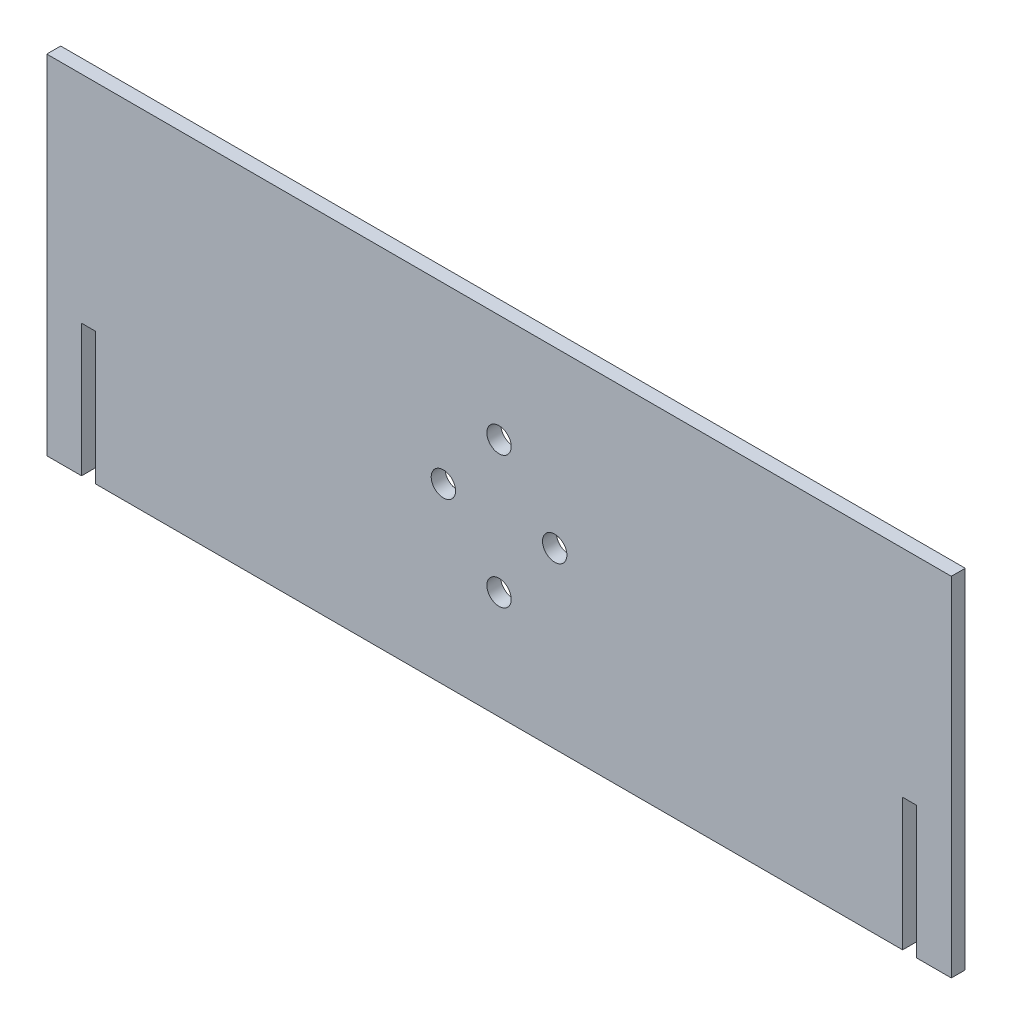
ISO-10303-21;
HEADER;
FILE_DESCRIPTION(('STEP AP214'),'2;1');
FILE_NAME('part.step','',(''),(''),'','','');
FILE_SCHEMA(('AUTOMOTIVE_DESIGN { 1 0 10303 214 1 1 1 1 }'));
ENDSEC;
DATA;
#1=APPLICATION_CONTEXT('core data for automotive mechanical design processes');
#2=APPLICATION_PROTOCOL_DEFINITION('international standard','automotive_design',2000,#1);
#3=PRODUCT_CONTEXT('',#1,'mechanical');
#4=PRODUCT('Part','Part','',(#3));
#5=PRODUCT_RELATED_PRODUCT_CATEGORY('part','',(#4));
#6=PRODUCT_DEFINITION_FORMATION('','',#4);
#7=PRODUCT_DEFINITION_CONTEXT('part definition',#1,'design');
#8=PRODUCT_DEFINITION('design','',#6,#7);
#9=PRODUCT_DEFINITION_SHAPE('','',#8);
#10=(LENGTH_UNIT() NAMED_UNIT(*) SI_UNIT(.MILLI.,.METRE.));
#11=(NAMED_UNIT(*) PLANE_ANGLE_UNIT() SI_UNIT($,.RADIAN.));
#12=(NAMED_UNIT(*) SI_UNIT($,.STERADIAN.) SOLID_ANGLE_UNIT());
#13=UNCERTAINTY_MEASURE_WITH_UNIT(LENGTH_MEASURE(1.E-05),#10,'distance_accuracy_value','');
#14=(GEOMETRIC_REPRESENTATION_CONTEXT(3) GLOBAL_UNCERTAINTY_ASSIGNED_CONTEXT((#13)) GLOBAL_UNIT_ASSIGNED_CONTEXT((#10,
#11,#12)) REPRESENTATION_CONTEXT('',''));
#15=CARTESIAN_POINT('',(0.,0.,0.));
#16=DIRECTION('',(0.,0.,1.));
#17=DIRECTION('',(1.,0.,0.));
#18=AXIS2_PLACEMENT_3D('',#15,#16,#17);
#19=CARTESIAN_POINT('',(0.,0.,1.));
#20=DIRECTION('',(0.,0.,-1.));
#21=DIRECTION('',(-1.,0.,0.));
#22=AXIS2_PLACEMENT_3D('',#19,#20,#21);
#23=PLANE('',#22);
#24=DIRECTION('',(1.,0.,0.));
#25=VECTOR('',#24,1.);
#26=CARTESIAN_POINT('',(60.,-25.,1.));
#27=LINE('',#26,#25);
#28=CARTESIAN_POINT('',(60.,-25.,1.));
#29=VERTEX_POINT('',#28);
#30=CARTESIAN_POINT('',(65.,-25.,1.));
#31=VERTEX_POINT('',#30);
#32=EDGE_CURVE('E206',#29,#31,#27,.T.);
#33=ORIENTED_EDGE('',*,*,#32,.T.);
#34=DIRECTION('',(0.,1.,0.));
#35=VECTOR('',#34,1.);
#36=CARTESIAN_POINT('',(65.,25.,1.));
#37=LINE('',#36,#35);
#38=CARTESIAN_POINT('',(65.,25.,1.));
#39=VERTEX_POINT('',#38);
#40=EDGE_CURVE('E118',#31,#39,#37,.T.);
#41=ORIENTED_EDGE('',*,*,#40,.T.);
#42=DIRECTION('',(-1.,0.,0.));
#43=VECTOR('',#42,1.);
#44=CARTESIAN_POINT('',(-65.,25.,1.));
#45=LINE('',#44,#43);
#46=CARTESIAN_POINT('',(-65.,25.,1.));
#47=VERTEX_POINT('',#46);
#48=EDGE_CURVE('E243',#39,#47,#45,.T.);
#49=ORIENTED_EDGE('',*,*,#48,.T.);
#50=DIRECTION('',(0.,-1.,0.));
#51=VECTOR('',#50,1.);
#52=CARTESIAN_POINT('',(-65.,25.,1.));
#53=LINE('',#52,#51);
#54=CARTESIAN_POINT('',(-65.,-25.,1.));
#55=VERTEX_POINT('',#54);
#56=EDGE_CURVE('E263',#47,#55,#53,.T.);
#57=ORIENTED_EDGE('',*,*,#56,.T.);
#58=DIRECTION('',(1.,0.,0.));
#59=VECTOR('',#58,1.);
#60=CARTESIAN_POINT('',(-65.,-25.,1.));
#61=LINE('',#60,#59);
#62=CARTESIAN_POINT('',(-60.,-25.,1.));
#63=VERTEX_POINT('',#62);
#64=EDGE_CURVE('E259',#55,#63,#61,.T.);
#65=ORIENTED_EDGE('',*,*,#64,.T.);
#66=DIRECTION('',(0.,1.,0.));
#67=VECTOR('',#66,1.);
#68=CARTESIAN_POINT('',(-60.,-6.00000000000002,1.));
#69=LINE('',#68,#67);
#70=CARTESIAN_POINT('',(-60.,-6.00000000000002,1.));
#71=VERTEX_POINT('',#70);
#72=EDGE_CURVE('E262',#63,#71,#69,.T.);
#73=ORIENTED_EDGE('',*,*,#72,.T.);
#74=DIRECTION('',(1.,0.,0.));
#75=VECTOR('',#74,1.);
#76=CARTESIAN_POINT('',(-58.,-6.00000000000002,1.));
#77=LINE('',#76,#75);
#78=CARTESIAN_POINT('',(-58.,-6.00000000000002,1.));
#79=VERTEX_POINT('',#78);
#80=EDGE_CURVE('E267',#71,#79,#77,.T.);
#81=ORIENTED_EDGE('',*,*,#80,.T.);
#82=DIRECTION('',(0.,-1.,0.));
#83=VECTOR('',#82,1.);
#84=CARTESIAN_POINT('',(-58.,-6.00000000000002,1.));
#85=LINE('',#84,#83);
#86=CARTESIAN_POINT('',(-58.,-25.,1.));
#87=VERTEX_POINT('',#86);
#88=EDGE_CURVE('E274',#79,#87,#85,.T.);
#89=ORIENTED_EDGE('',*,*,#88,.T.);
#90=DIRECTION('',(1.,0.,0.));
#91=VECTOR('',#90,1.);
#92=CARTESIAN_POINT('',(-58.,-25.,1.));
#93=LINE('',#92,#91);
#94=CARTESIAN_POINT('',(58.,-25.,1.));
#95=VERTEX_POINT('',#94);
#96=EDGE_CURVE('E149',#87,#95,#93,.T.);
#97=ORIENTED_EDGE('',*,*,#96,.T.);
#98=DIRECTION('',(0.,1.,0.));
#99=VECTOR('',#98,1.);
#100=CARTESIAN_POINT('',(58.,-6.00000000000001,1.));
#101=LINE('',#100,#99);
#102=CARTESIAN_POINT('',(58.,-6.00000000000001,1.));
#103=VERTEX_POINT('',#102);
#104=EDGE_CURVE('E143',#95,#103,#101,.T.);
#105=ORIENTED_EDGE('',*,*,#104,.T.);
#106=DIRECTION('',(1.,0.,0.));
#107=VECTOR('',#106,1.);
#108=CARTESIAN_POINT('',(58.,-6.00000000000001,1.));
#109=LINE('',#108,#107);
#110=CARTESIAN_POINT('',(60.,-6.00000000000001,1.));
#111=VERTEX_POINT('',#110);
#112=EDGE_CURVE('E147',#103,#111,#109,.T.);
#113=ORIENTED_EDGE('',*,*,#112,.T.);
#114=DIRECTION('',(0.,-1.,0.));
#115=VECTOR('',#114,1.);
#116=CARTESIAN_POINT('',(60.,-6.00000000000001,1.));
#117=LINE('',#116,#115);
#118=EDGE_CURVE('E63',#111,#29,#117,.T.);
#119=ORIENTED_EDGE('',*,*,#118,.T.);
#120=EDGE_LOOP('',(#33,#41,#49,#57,#65,#73,#81,#89,#97,#105,#113,#119));
#121=FACE_BOUND('',#120,.T.);
#122=CARTESIAN_POINT('',(0.,9.5,1.));
#123=DIRECTION('',(0.,0.,1.));
#124=DIRECTION('',(1.,0.,0.));
#125=AXIS2_PLACEMENT_3D('',#122,#123,#124);
#126=CIRCLE('',#125,1.75);
#127=CARTESIAN_POINT('',(1.75,9.5,1.));
#128=VERTEX_POINT('',#127);
#129=EDGE_CURVE('E176',#128,#128,#126,.T.);
#130=ORIENTED_EDGE('',*,*,#129,.F.);
#131=EDGE_LOOP('',(#130));
#132=FACE_BOUND('',#131,.T.);
#133=CARTESIAN_POINT('',(8.,0.,1.));
#134=DIRECTION('',(0.,0.,1.));
#135=DIRECTION('',(1.,0.,0.));
#136=AXIS2_PLACEMENT_3D('',#133,#134,#135);
#137=CIRCLE('',#136,1.75);
#138=CARTESIAN_POINT('',(9.75,0.,1.));
#139=VERTEX_POINT('',#138);
#140=EDGE_CURVE('E344',#139,#139,#137,.T.);
#141=ORIENTED_EDGE('',*,*,#140,.F.);
#142=EDGE_LOOP('',(#141));
#143=FACE_BOUND('',#142,.T.);
#144=CARTESIAN_POINT('',(0.,-9.49999999999999,1.));
#145=DIRECTION('',(0.,0.,1.));
#146=DIRECTION('',(1.,0.,0.));
#147=AXIS2_PLACEMENT_3D('',#144,#145,#146);
#148=CIRCLE('',#147,1.75);
#149=CARTESIAN_POINT('',(1.75,-9.49999999999999,1.));
#150=VERTEX_POINT('',#149);
#151=EDGE_CURVE('E336',#150,#150,#148,.T.);
#152=ORIENTED_EDGE('',*,*,#151,.F.);
#153=EDGE_LOOP('',(#152));
#154=FACE_BOUND('',#153,.T.);
#155=CARTESIAN_POINT('',(-8.,0.,1.));
#156=DIRECTION('',(0.,0.,1.));
#157=DIRECTION('',(1.,0.,0.));
#158=AXIS2_PLACEMENT_3D('',#155,#156,#157);
#159=CIRCLE('',#158,1.75);
#160=CARTESIAN_POINT('',(-6.25,0.,1.));
#161=VERTEX_POINT('',#160);
#162=EDGE_CURVE('E325',#161,#161,#159,.T.);
#163=ORIENTED_EDGE('',*,*,#162,.F.);
#164=EDGE_LOOP('',(#163));
#165=FACE_BOUND('',#164,.T.);
#166=ADVANCED_FACE('F45',(#121,#132,#143,#154,#165),#23,.F.);
#167=CARTESIAN_POINT('',(0.,0.,-1.));
#168=DIRECTION('',(0.,0.,-1.));
#169=DIRECTION('',(-1.,0.,0.));
#170=AXIS2_PLACEMENT_3D('',#167,#168,#169);
#171=PLANE('',#170);
#172=CARTESIAN_POINT('',(0.,-9.49999999999999,-1.));
#173=DIRECTION('',(0.,0.,1.));
#174=DIRECTION('',(1.,0.,0.));
#175=AXIS2_PLACEMENT_3D('',#172,#173,#174);
#176=CIRCLE('',#175,1.75);
#177=CARTESIAN_POINT('',(1.75,-9.49999999999999,-1.));
#178=VERTEX_POINT('',#177);
#179=EDGE_CURVE('E333',#178,#178,#176,.T.);
#180=ORIENTED_EDGE('',*,*,#179,.T.);
#181=EDGE_LOOP('',(#180));
#182=FACE_BOUND('',#181,.T.);
#183=CARTESIAN_POINT('',(0.,9.5,-1.));
#184=DIRECTION('',(0.,0.,1.));
#185=DIRECTION('',(1.,0.,0.));
#186=AXIS2_PLACEMENT_3D('',#183,#184,#185);
#187=CIRCLE('',#186,1.75);
#188=CARTESIAN_POINT('',(1.75,9.5,-1.));
#189=VERTEX_POINT('',#188);
#190=EDGE_CURVE('E348',#189,#189,#187,.T.);
#191=ORIENTED_EDGE('',*,*,#190,.T.);
#192=EDGE_LOOP('',(#191));
#193=FACE_BOUND('',#192,.T.);
#194=DIRECTION('',(1.,0.,0.));
#195=VECTOR('',#194,1.);
#196=CARTESIAN_POINT('',(60.,-25.,-1.));
#197=LINE('',#196,#195);
#198=CARTESIAN_POINT('',(60.,-25.,-1.));
#199=VERTEX_POINT('',#198);
#200=CARTESIAN_POINT('',(65.,-25.,-1.));
#201=VERTEX_POINT('',#200);
#202=EDGE_CURVE('E171',#199,#201,#197,.T.);
#203=ORIENTED_EDGE('',*,*,#202,.F.);
#204=DIRECTION('',(0.,-1.,0.));
#205=VECTOR('',#204,1.);
#206=CARTESIAN_POINT('',(60.,-6.00000000000001,-1.));
#207=LINE('',#206,#205);
#208=CARTESIAN_POINT('',(60.,-6.00000000000001,-1.));
#209=VERTEX_POINT('',#208);
#210=EDGE_CURVE('E110',#209,#199,#207,.T.);
#211=ORIENTED_EDGE('',*,*,#210,.F.);
#212=DIRECTION('',(1.,0.,0.));
#213=VECTOR('',#212,1.);
#214=CARTESIAN_POINT('',(58.,-6.00000000000001,-1.));
#215=LINE('',#214,#213);
#216=CARTESIAN_POINT('',(58.,-6.00000000000001,-1.));
#217=VERTEX_POINT('',#216);
#218=EDGE_CURVE('E104',#217,#209,#215,.T.);
#219=ORIENTED_EDGE('',*,*,#218,.F.);
#220=DIRECTION('',(0.,1.,0.));
#221=VECTOR('',#220,1.);
#222=CARTESIAN_POINT('',(58.,-6.00000000000001,-1.));
#223=LINE('',#222,#221);
#224=CARTESIAN_POINT('',(58.,-25.,-1.));
#225=VERTEX_POINT('',#224);
#226=EDGE_CURVE('E158',#225,#217,#223,.T.);
#227=ORIENTED_EDGE('',*,*,#226,.F.);
#228=DIRECTION('',(1.,0.,0.));
#229=VECTOR('',#228,1.);
#230=CARTESIAN_POINT('',(-58.,-25.,-1.));
#231=LINE('',#230,#229);
#232=CARTESIAN_POINT('',(-58.,-25.,-1.));
#233=VERTEX_POINT('',#232);
#234=EDGE_CURVE('E197',#233,#225,#231,.T.);
#235=ORIENTED_EDGE('',*,*,#234,.F.);
#236=DIRECTION('',(0.,-1.,0.));
#237=VECTOR('',#236,1.);
#238=CARTESIAN_POINT('',(-58.,-6.00000000000002,-1.));
#239=LINE('',#238,#237);
#240=CARTESIAN_POINT('',(-58.,-6.00000000000002,-1.));
#241=VERTEX_POINT('',#240);
#242=EDGE_CURVE('E194',#241,#233,#239,.T.);
#243=ORIENTED_EDGE('',*,*,#242,.F.);
#244=DIRECTION('',(1.,0.,0.));
#245=VECTOR('',#244,1.);
#246=CARTESIAN_POINT('',(-58.,-6.00000000000002,-1.));
#247=LINE('',#246,#245);
#248=CARTESIAN_POINT('',(-60.,-6.00000000000002,-1.));
#249=VERTEX_POINT('',#248);
#250=EDGE_CURVE('E191',#249,#241,#247,.T.);
#251=ORIENTED_EDGE('',*,*,#250,.F.);
#252=DIRECTION('',(0.,1.,0.));
#253=VECTOR('',#252,1.);
#254=CARTESIAN_POINT('',(-60.,-6.00000000000002,-1.));
#255=LINE('',#254,#253);
#256=CARTESIAN_POINT('',(-60.,-25.,-1.));
#257=VERTEX_POINT('',#256);
#258=EDGE_CURVE('E188',#257,#249,#255,.T.);
#259=ORIENTED_EDGE('',*,*,#258,.F.);
#260=DIRECTION('',(1.,0.,0.));
#261=VECTOR('',#260,1.);
#262=CARTESIAN_POINT('',(-65.,-25.,-1.));
#263=LINE('',#262,#261);
#264=CARTESIAN_POINT('',(-65.,-25.,-1.));
#265=VERTEX_POINT('',#264);
#266=EDGE_CURVE('E185',#265,#257,#263,.T.);
#267=ORIENTED_EDGE('',*,*,#266,.F.);
#268=DIRECTION('',(0.,-1.,0.));
#269=VECTOR('',#268,1.);
#270=CARTESIAN_POINT('',(-65.,25.,-1.));
#271=LINE('',#270,#269);
#272=CARTESIAN_POINT('',(-65.,25.,-1.));
#273=VERTEX_POINT('',#272);
#274=EDGE_CURVE('E182',#273,#265,#271,.T.);
#275=ORIENTED_EDGE('',*,*,#274,.F.);
#276=DIRECTION('',(-1.,0.,0.));
#277=VECTOR('',#276,1.);
#278=CARTESIAN_POINT('',(-65.,25.,-1.));
#279=LINE('',#278,#277);
#280=CARTESIAN_POINT('',(65.,25.,-1.));
#281=VERTEX_POINT('',#280);
#282=EDGE_CURVE('E179',#281,#273,#279,.T.);
#283=ORIENTED_EDGE('',*,*,#282,.F.);
#284=DIRECTION('',(0.,1.,0.));
#285=VECTOR('',#284,1.);
#286=CARTESIAN_POINT('',(65.,25.,-1.));
#287=LINE('',#286,#285);
#288=EDGE_CURVE('E175',#201,#281,#287,.T.);
#289=ORIENTED_EDGE('',*,*,#288,.F.);
#290=EDGE_LOOP('',(#203,#211,#219,#227,#235,#243,#251,#259,#267,#275,#283,#289));
#291=FACE_BOUND('',#290,.T.);
#292=CARTESIAN_POINT('',(8.,0.,-1.));
#293=DIRECTION('',(0.,0.,1.));
#294=DIRECTION('',(1.,0.,0.));
#295=AXIS2_PLACEMENT_3D('',#292,#293,#294);
#296=CIRCLE('',#295,1.75);
#297=CARTESIAN_POINT('',(9.75,0.,-1.));
#298=VERTEX_POINT('',#297);
#299=EDGE_CURVE('E340',#298,#298,#296,.T.);
#300=ORIENTED_EDGE('',*,*,#299,.T.);
#301=EDGE_LOOP('',(#300));
#302=FACE_BOUND('',#301,.T.);
#303=CARTESIAN_POINT('',(-8.,0.,-1.));
#304=DIRECTION('',(0.,0.,1.));
#305=DIRECTION('',(1.,0.,0.));
#306=AXIS2_PLACEMENT_3D('',#303,#304,#305);
#307=CIRCLE('',#306,1.75);
#308=CARTESIAN_POINT('',(-6.25,0.,-1.));
#309=VERTEX_POINT('',#308);
#310=EDGE_CURVE('E328',#309,#309,#307,.T.);
#311=ORIENTED_EDGE('',*,*,#310,.T.);
#312=EDGE_LOOP('',(#311));
#313=FACE_BOUND('',#312,.T.);
#314=ADVANCED_FACE('F247',(#182,#193,#291,#302,#313),#171,.T.);
#315=CARTESIAN_POINT('',(60.,-25.,1.));
#316=DIRECTION('',(0.,1.,0.));
#317=DIRECTION('',(-1.,0.,0.));
#318=AXIS2_PLACEMENT_3D('',#315,#316,#317);
#319=PLANE('',#318);
#320=ORIENTED_EDGE('',*,*,#202,.T.);
#321=DIRECTION('',(0.,0.,-1.));
#322=VECTOR('',#321,1.);
#323=CARTESIAN_POINT('',(65.,-25.,1.));
#324=LINE('',#323,#322);
#325=EDGE_CURVE('E11',#31,#201,#324,.T.);
#326=ORIENTED_EDGE('',*,*,#325,.F.);
#327=ORIENTED_EDGE('',*,*,#32,.F.);
#328=DIRECTION('',(0.,0.,-1.));
#329=VECTOR('',#328,1.);
#330=CARTESIAN_POINT('',(60.,-25.,1.));
#331=LINE('',#330,#329);
#332=EDGE_CURVE('E167',#29,#199,#331,.T.);
#333=ORIENTED_EDGE('',*,*,#332,.T.);
#334=EDGE_LOOP('',(#320,#326,#327,#333));
#335=FACE_BOUND('',#334,.T.);
#336=ADVANCED_FACE('F47',(#335),#319,.F.);
#337=CARTESIAN_POINT('',(65.,25.,1.));
#338=DIRECTION('',(-1.,0.,0.));
#339=DIRECTION('',(0.,-1.,0.));
#340=AXIS2_PLACEMENT_3D('',#337,#338,#339);
#341=PLANE('',#340);
#342=ORIENTED_EDGE('',*,*,#288,.T.);
#343=DIRECTION('',(0.,0.,-1.));
#344=VECTOR('',#343,1.);
#345=CARTESIAN_POINT('',(65.,25.,1.));
#346=LINE('',#345,#344);
#347=EDGE_CURVE('E55',#39,#281,#346,.T.);
#348=ORIENTED_EDGE('',*,*,#347,.F.);
#349=ORIENTED_EDGE('',*,*,#40,.F.);
#350=ORIENTED_EDGE('',*,*,#325,.T.);
#351=EDGE_LOOP('',(#342,#348,#349,#350));
#352=FACE_BOUND('',#351,.T.);
#353=ADVANCED_FACE('F470',(#352),#341,.F.);
#354=CARTESIAN_POINT('',(-65.,25.,1.));
#355=DIRECTION('',(0.,-1.,0.));
#356=DIRECTION('',(0.,0.,-1.));
#357=AXIS2_PLACEMENT_3D('',#354,#355,#356);
#358=PLANE('',#357);
#359=ORIENTED_EDGE('',*,*,#282,.T.);
#360=DIRECTION('',(0.,0.,-1.));
#361=VECTOR('',#360,1.);
#362=CARTESIAN_POINT('',(-65.,25.,1.));
#363=LINE('',#362,#361);
#364=EDGE_CURVE('E233',#47,#273,#363,.T.);
#365=ORIENTED_EDGE('',*,*,#364,.F.);
#366=ORIENTED_EDGE('',*,*,#48,.F.);
#367=ORIENTED_EDGE('',*,*,#347,.T.);
#368=EDGE_LOOP('',(#359,#365,#366,#367));
#369=FACE_BOUND('',#368,.T.);
#370=ADVANCED_FACE('F241',(#369),#358,.F.);
#371=CARTESIAN_POINT('',(-65.,25.,1.));
#372=DIRECTION('',(1.,0.,0.));
#373=DIRECTION('',(0.,0.,-1.));
#374=AXIS2_PLACEMENT_3D('',#371,#372,#373);
#375=PLANE('',#374);
#376=ORIENTED_EDGE('',*,*,#274,.T.);
#377=DIRECTION('',(0.,0.,-1.));
#378=VECTOR('',#377,1.);
#379=CARTESIAN_POINT('',(-65.,-25.,1.));
#380=LINE('',#379,#378);
#381=EDGE_CURVE('E229',#55,#265,#380,.T.);
#382=ORIENTED_EDGE('',*,*,#381,.F.);
#383=ORIENTED_EDGE('',*,*,#56,.F.);
#384=ORIENTED_EDGE('',*,*,#364,.T.);
#385=EDGE_LOOP('',(#376,#382,#383,#384));
#386=FACE_BOUND('',#385,.T.);
#387=ADVANCED_FACE('F253',(#386),#375,.F.);
#388=CARTESIAN_POINT('',(-65.,-25.,1.));
#389=DIRECTION('',(0.,1.,0.));
#390=DIRECTION('',(-1.,0.,0.));
#391=AXIS2_PLACEMENT_3D('',#388,#389,#390);
#392=PLANE('',#391);
#393=ORIENTED_EDGE('',*,*,#266,.T.);
#394=DIRECTION('',(0.,0.,-1.));
#395=VECTOR('',#394,1.);
#396=CARTESIAN_POINT('',(-60.,-25.,1.));
#397=LINE('',#396,#395);
#398=EDGE_CURVE('E225',#63,#257,#397,.T.);
#399=ORIENTED_EDGE('',*,*,#398,.F.);
#400=ORIENTED_EDGE('',*,*,#64,.F.);
#401=ORIENTED_EDGE('',*,*,#381,.T.);
#402=EDGE_LOOP('',(#393,#399,#400,#401));
#403=FACE_BOUND('',#402,.T.);
#404=ADVANCED_FACE('F257',(#403),#392,.F.);
#405=CARTESIAN_POINT('',(-60.,-6.00000000000002,1.));
#406=DIRECTION('',(-1.,0.,0.));
#407=DIRECTION('',(0.,-1.,0.));
#408=AXIS2_PLACEMENT_3D('',#405,#406,#407);
#409=PLANE('',#408);
#410=ORIENTED_EDGE('',*,*,#258,.T.);
#411=DIRECTION('',(0.,0.,-1.));
#412=VECTOR('',#411,1.);
#413=CARTESIAN_POINT('',(-60.,-6.00000000000002,1.));
#414=LINE('',#413,#412);
#415=EDGE_CURVE('E221',#71,#249,#414,.T.);
#416=ORIENTED_EDGE('',*,*,#415,.F.);
#417=ORIENTED_EDGE('',*,*,#72,.F.);
#418=ORIENTED_EDGE('',*,*,#398,.T.);
#419=EDGE_LOOP('',(#410,#416,#417,#418));
#420=FACE_BOUND('',#419,.T.);
#421=ADVANCED_FACE('F435',(#420),#409,.F.);
#422=CARTESIAN_POINT('',(-58.,-6.00000000000002,1.));
#423=DIRECTION('',(0.,1.,0.));
#424=DIRECTION('',(-1.,0.,0.));
#425=AXIS2_PLACEMENT_3D('',#422,#423,#424);
#426=PLANE('',#425);
#427=ORIENTED_EDGE('',*,*,#250,.T.);
#428=DIRECTION('',(0.,0.,-1.));
#429=VECTOR('',#428,1.);
#430=CARTESIAN_POINT('',(-58.,-6.00000000000002,1.));
#431=LINE('',#430,#429);
#432=EDGE_CURVE('E217',#79,#241,#431,.T.);
#433=ORIENTED_EDGE('',*,*,#432,.F.);
#434=ORIENTED_EDGE('',*,*,#80,.F.);
#435=ORIENTED_EDGE('',*,*,#415,.T.);
#436=EDGE_LOOP('',(#427,#433,#434,#435));
#437=FACE_BOUND('',#436,.T.);
#438=ADVANCED_FACE('F426',(#437),#426,.F.);
#439=CARTESIAN_POINT('',(-58.,-6.00000000000002,1.));
#440=DIRECTION('',(1.,0.,0.));
#441=DIRECTION('',(0.,1.,0.));
#442=AXIS2_PLACEMENT_3D('',#439,#440,#441);
#443=PLANE('',#442);
#444=ORIENTED_EDGE('',*,*,#242,.T.);
#445=DIRECTION('',(0.,0.,-1.));
#446=VECTOR('',#445,1.);
#447=CARTESIAN_POINT('',(-58.,-25.,1.));
#448=LINE('',#447,#446);
#449=EDGE_CURVE('E213',#87,#233,#448,.T.);
#450=ORIENTED_EDGE('',*,*,#449,.F.);
#451=ORIENTED_EDGE('',*,*,#88,.F.);
#452=ORIENTED_EDGE('',*,*,#432,.T.);
#453=EDGE_LOOP('',(#444,#450,#451,#452));
#454=FACE_BOUND('',#453,.T.);
#455=ADVANCED_FACE('F282',(#454),#443,.F.);
#456=CARTESIAN_POINT('',(-58.,-25.,1.));
#457=DIRECTION('',(0.,1.,0.));
#458=DIRECTION('',(0.,0.,1.));
#459=AXIS2_PLACEMENT_3D('',#456,#457,#458);
#460=PLANE('',#459);
#461=ORIENTED_EDGE('',*,*,#234,.T.);
#462=DIRECTION('',(0.,0.,-1.));
#463=VECTOR('',#462,1.);
#464=CARTESIAN_POINT('',(58.,-25.,1.));
#465=LINE('',#464,#463);
#466=EDGE_CURVE('E160',#95,#225,#465,.T.);
#467=ORIENTED_EDGE('',*,*,#466,.F.);
#468=ORIENTED_EDGE('',*,*,#96,.F.);
#469=ORIENTED_EDGE('',*,*,#449,.T.);
#470=EDGE_LOOP('',(#461,#467,#468,#469));
#471=FACE_BOUND('',#470,.T.);
#472=ADVANCED_FACE('F286',(#471),#460,.F.);
#473=CARTESIAN_POINT('',(58.,-6.00000000000001,1.));
#474=DIRECTION('',(-1.,0.,0.));
#475=DIRECTION('',(0.,0.,1.));
#476=AXIS2_PLACEMENT_3D('',#473,#474,#475);
#477=PLANE('',#476);
#478=ORIENTED_EDGE('',*,*,#226,.T.);
#479=DIRECTION('',(0.,0.,-1.));
#480=VECTOR('',#479,1.);
#481=CARTESIAN_POINT('',(58.,-6.00000000000001,1.));
#482=LINE('',#481,#480);
#483=EDGE_CURVE('E155',#103,#217,#482,.T.);
#484=ORIENTED_EDGE('',*,*,#483,.F.);
#485=ORIENTED_EDGE('',*,*,#104,.F.);
#486=ORIENTED_EDGE('',*,*,#466,.T.);
#487=EDGE_LOOP('',(#478,#484,#485,#486));
#488=FACE_BOUND('',#487,.T.);
#489=ADVANCED_FACE('F156',(#488),#477,.F.);
#490=CARTESIAN_POINT('',(58.,-6.00000000000001,1.));
#491=DIRECTION('',(0.,1.,0.));
#492=DIRECTION('',(0.,0.,1.));
#493=AXIS2_PLACEMENT_3D('',#490,#491,#492);
#494=PLANE('',#493);
#495=ORIENTED_EDGE('',*,*,#218,.T.);
#496=DIRECTION('',(0.,0.,-1.));
#497=VECTOR('',#496,1.);
#498=CARTESIAN_POINT('',(60.,-6.00000000000001,1.));
#499=LINE('',#498,#497);
#500=EDGE_CURVE('E161',#111,#209,#499,.T.);
#501=ORIENTED_EDGE('',*,*,#500,.F.);
#502=ORIENTED_EDGE('',*,*,#112,.F.);
#503=ORIENTED_EDGE('',*,*,#483,.T.);
#504=EDGE_LOOP('',(#495,#501,#502,#503));
#505=FACE_BOUND('',#504,.T.);
#506=ADVANCED_FACE('F163',(#505),#494,.F.);
#507=CARTESIAN_POINT('',(60.,-6.00000000000001,1.));
#508=DIRECTION('',(1.,0.,0.));
#509=DIRECTION('',(0.,0.,-1.));
#510=AXIS2_PLACEMENT_3D('',#507,#508,#509);
#511=PLANE('',#510);
#512=ORIENTED_EDGE('',*,*,#210,.T.);
#513=ORIENTED_EDGE('',*,*,#332,.F.);
#514=ORIENTED_EDGE('',*,*,#118,.F.);
#515=ORIENTED_EDGE('',*,*,#500,.T.);
#516=EDGE_LOOP('',(#512,#513,#514,#515));
#517=FACE_BOUND('',#516,.T.);
#518=ADVANCED_FACE('F290',(#517),#511,.F.);
#519=CARTESIAN_POINT('',(0.,9.5,1.));
#520=DIRECTION('',(0.,0.,-1.));
#521=DIRECTION('',(-1.,0.,0.));
#522=AXIS2_PLACEMENT_3D('',#519,#520,#521);
#523=CYLINDRICAL_SURFACE('',#522,1.75);
#524=ORIENTED_EDGE('',*,*,#129,.T.);
#525=EDGE_LOOP('',(#524));
#526=FACE_BOUND('',#525,.T.);
#527=ORIENTED_EDGE('',*,*,#190,.F.);
#528=EDGE_LOOP('',(#527));
#529=FACE_BOUND('',#528,.T.);
#530=ADVANCED_FACE('F292',(#526,#529),#523,.F.);
#531=CARTESIAN_POINT('',(8.,0.,1.));
#532=DIRECTION('',(0.,0.,-1.));
#533=DIRECTION('',(-1.,0.,0.));
#534=AXIS2_PLACEMENT_3D('',#531,#532,#533);
#535=CYLINDRICAL_SURFACE('',#534,1.75);
#536=ORIENTED_EDGE('',*,*,#140,.T.);
#537=EDGE_LOOP('',(#536));
#538=FACE_BOUND('',#537,.T.);
#539=ORIENTED_EDGE('',*,*,#299,.F.);
#540=EDGE_LOOP('',(#539));
#541=FACE_BOUND('',#540,.T.);
#542=ADVANCED_FACE('F298',(#538,#541),#535,.F.);
#543=CARTESIAN_POINT('',(0.,-9.49999999999999,1.));
#544=DIRECTION('',(0.,0.,-1.));
#545=DIRECTION('',(-1.,0.,0.));
#546=AXIS2_PLACEMENT_3D('',#543,#544,#545);
#547=CYLINDRICAL_SURFACE('',#546,1.75);
#548=ORIENTED_EDGE('',*,*,#151,.T.);
#549=EDGE_LOOP('',(#548));
#550=FACE_BOUND('',#549,.T.);
#551=ORIENTED_EDGE('',*,*,#179,.F.);
#552=EDGE_LOOP('',(#551));
#553=FACE_BOUND('',#552,.T.);
#554=ADVANCED_FACE('F312',(#550,#553),#547,.F.);
#555=CARTESIAN_POINT('',(-8.,0.,1.));
#556=DIRECTION('',(0.,0.,-1.));
#557=DIRECTION('',(-1.,0.,0.));
#558=AXIS2_PLACEMENT_3D('',#555,#556,#557);
#559=CYLINDRICAL_SURFACE('',#558,1.75);
#560=ORIENTED_EDGE('',*,*,#162,.T.);
#561=EDGE_LOOP('',(#560));
#562=FACE_BOUND('',#561,.T.);
#563=ORIENTED_EDGE('',*,*,#310,.F.);
#564=EDGE_LOOP('',(#563));
#565=FACE_BOUND('',#564,.T.);
#566=ADVANCED_FACE('F316',(#562,#565),#559,.F.);
#567=CLOSED_SHELL('',(#166,#314,#336,#353,#370,#387,#404,#421,#438,#455,#472,#489,#506,#518,
#530,#542,#554,#566));
#568=MANIFOLD_SOLID_BREP('B2',#567);
#569=ADVANCED_BREP_SHAPE_REPRESENTATION('',(#18,#568),#14);
#570=SHAPE_DEFINITION_REPRESENTATION(#9,#569);
ENDSEC;
END-ISO-10303-21;
